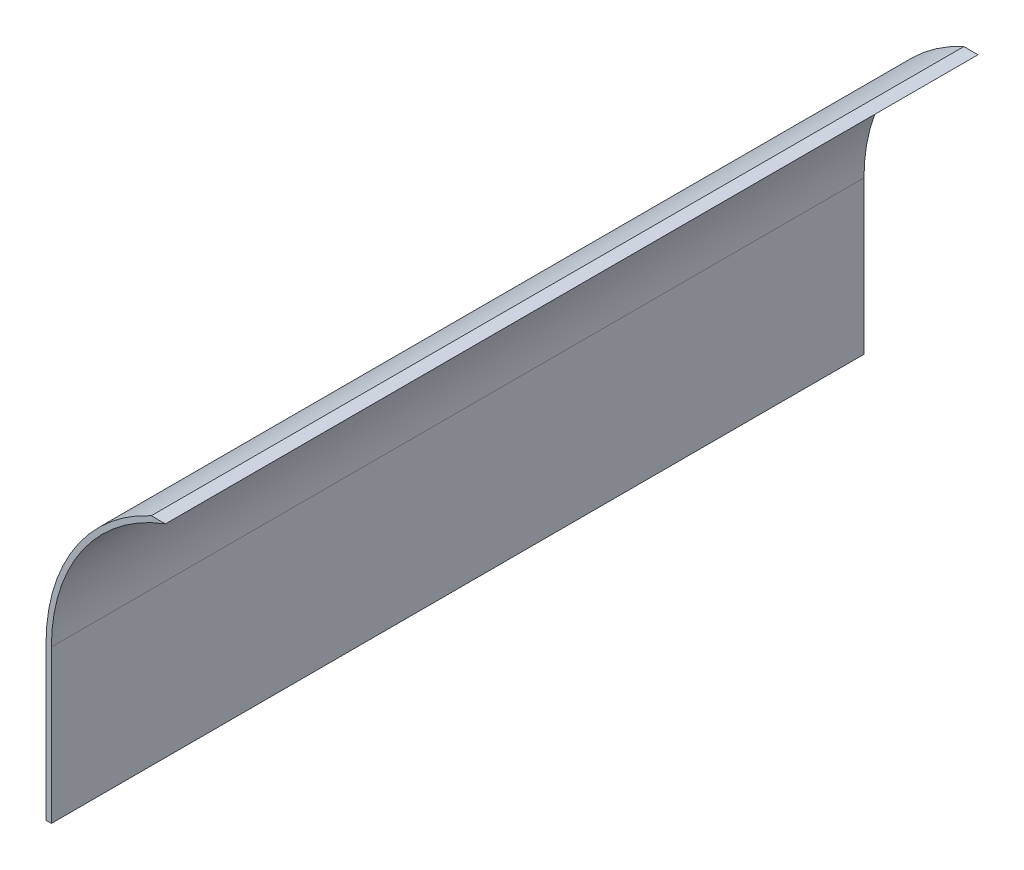
ISO-10303-21;
HEADER;
FILE_DESCRIPTION(('STEP AP214'),'2;1');
FILE_NAME('part.step','',(''),(''),'','','');
FILE_SCHEMA(('AUTOMOTIVE_DESIGN { 1 0 10303 214 1 1 1 1 }'));
ENDSEC;
DATA;
#1=APPLICATION_CONTEXT('core data for automotive mechanical design processes');
#2=APPLICATION_PROTOCOL_DEFINITION('international standard','automotive_design',2000,#1);
#3=PRODUCT_CONTEXT('',#1,'mechanical');
#4=PRODUCT('Part','Part','',(#3));
#5=PRODUCT_RELATED_PRODUCT_CATEGORY('part','',(#4));
#6=PRODUCT_DEFINITION_FORMATION('','',#4);
#7=PRODUCT_DEFINITION_CONTEXT('part definition',#1,'design');
#8=PRODUCT_DEFINITION('design','',#6,#7);
#9=PRODUCT_DEFINITION_SHAPE('','',#8);
#10=(LENGTH_UNIT() NAMED_UNIT(*) SI_UNIT(.MILLI.,.METRE.));
#11=(NAMED_UNIT(*) PLANE_ANGLE_UNIT() SI_UNIT($,.RADIAN.));
#12=(NAMED_UNIT(*) SI_UNIT($,.STERADIAN.) SOLID_ANGLE_UNIT());
#13=UNCERTAINTY_MEASURE_WITH_UNIT(LENGTH_MEASURE(1.E-05),#10,'distance_accuracy_value','');
#14=(GEOMETRIC_REPRESENTATION_CONTEXT(3) GLOBAL_UNCERTAINTY_ASSIGNED_CONTEXT((#13)) GLOBAL_UNIT_ASSIGNED_CONTEXT((#10,
#11,#12)) REPRESENTATION_CONTEXT('',''));
#15=CARTESIAN_POINT('',(0.,0.,0.));
#16=DIRECTION('',(0.,0.,1.));
#17=DIRECTION('',(1.,0.,0.));
#18=AXIS2_PLACEMENT_3D('',#15,#16,#17);
#19=CARTESIAN_POINT('',(-185.,-185.,1000.));
#20=DIRECTION('',(1.,0.,0.));
#21=DIRECTION('',(0.,0.,-1.));
#22=AXIS2_PLACEMENT_3D('',#19,#20,#21);
#23=PLANE('',#22);
#24=DIRECTION('',(0.,-1.,0.));
#25=VECTOR('',#24,1.);
#26=CARTESIAN_POINT('',(-185.,-185.,-1000.));
#27=LINE('',#26,#25);
#28=CARTESIAN_POINT('',(-185.,85.,-1000.));
#29=VERTEX_POINT('',#28);
#30=CARTESIAN_POINT('',(-185.,0.,-1000.));
#31=VERTEX_POINT('',#30);
#32=EDGE_CURVE('E99',#29,#31,#27,.T.);
#33=ORIENTED_EDGE('',*,*,#32,.T.);
#34=DIRECTION('',(0.,0.,-1.));
#35=VECTOR('',#34,1.);
#36=CARTESIAN_POINT('',(-185.,0.,-1000.));
#37=LINE('',#36,#35);
#38=CARTESIAN_POINT('',(-185.,0.,-548.));
#39=VERTEX_POINT('',#38);
#40=EDGE_CURVE('E86',#39,#31,#37,.T.);
#41=ORIENTED_EDGE('',*,*,#40,.F.);
#42=DIRECTION('',(0.,1.,0.));
#43=VECTOR('',#42,1.);
#44=CARTESIAN_POINT('',(-185.,581.96585350996,-548.));
#45=LINE('',#44,#43);
#46=CARTESIAN_POINT('',(-185.,85.,-548.));
#47=VERTEX_POINT('',#46);
#48=EDGE_CURVE('E131',#39,#47,#45,.T.);
#49=ORIENTED_EDGE('',*,*,#48,.T.);
#50=DIRECTION('',(0.,0.,-1.));
#51=VECTOR('',#50,1.);
#52=CARTESIAN_POINT('',(-185.,85.,1000.));
#53=LINE('',#52,#51);
#54=EDGE_CURVE('E105',#47,#29,#53,.T.);
#55=ORIENTED_EDGE('',*,*,#54,.T.);
#56=EDGE_LOOP('',(#33,#41,#49,#55));
#57=FACE_BOUND('',#56,.T.);
#58=ADVANCED_FACE('F36',(#57),#23,.F.);
#59=CARTESIAN_POINT('',(0.,0.,-1000.));
#60=DIRECTION('',(0.,0.,1.));
#61=DIRECTION('',(1.,0.,0.));
#62=AXIS2_PLACEMENT_3D('',#59,#60,#61);
#63=PLANE('',#62);
#64=DIRECTION('',(0.,-1.,0.));
#65=VECTOR('',#64,1.);
#66=CARTESIAN_POINT('',(-182.,-185.,-1000.));
#67=LINE('',#66,#65);
#68=CARTESIAN_POINT('',(-182.,85.,-1000.));
#69=VERTEX_POINT('',#68);
#70=CARTESIAN_POINT('',(-182.,0.,-1000.));
#71=VERTEX_POINT('',#70);
#72=EDGE_CURVE('E102',#69,#71,#67,.T.);
#73=ORIENTED_EDGE('',*,*,#72,.T.);
#74=DIRECTION('',(-1.,0.,0.));
#75=VECTOR('',#74,1.);
#76=CARTESIAN_POINT('',(-118.585711247492,0.,-1000.));
#77=LINE('',#76,#75);
#78=EDGE_CURVE('E89',#71,#31,#77,.T.);
#79=ORIENTED_EDGE('',*,*,#78,.T.);
#80=ORIENTED_EDGE('',*,*,#32,.F.);
#81=CARTESIAN_POINT('',(-85.0000000000001,85.,-1000.));
#82=DIRECTION('',(0.,0.,1.));
#83=DIRECTION('',(1.,0.,0.));
#84=AXIS2_PLACEMENT_3D('',#81,#82,#83);
#85=CIRCLE('',#84,100.);
#86=CARTESIAN_POINT('',(-126.460824883255,176.,-1000.));
#87=VERTEX_POINT('',#86);
#88=EDGE_CURVE('E107',#29,#87,#85,.F.);
#89=ORIENTED_EDGE('',*,*,#88,.T.);
#90=DIRECTION('',(1.,0.,0.));
#91=VECTOR('',#90,1.);
#92=CARTESIAN_POINT('',(0.,176.,-1000.));
#93=LINE('',#92,#91);
#94=CARTESIAN_POINT('',(-118.585711247492,176.,-1000.));
#95=VERTEX_POINT('',#94);
#96=EDGE_CURVE('E133',#87,#95,#93,.T.);
#97=ORIENTED_EDGE('',*,*,#96,.T.);
#98=CARTESIAN_POINT('',(-85.0000000000001,85.,-1000.));
#99=DIRECTION('',(0.,0.,1.));
#100=DIRECTION('',(1.,0.,0.));
#101=AXIS2_PLACEMENT_3D('',#98,#99,#100);
#102=CIRCLE('',#101,97.);
#103=EDGE_CURVE('E111',#69,#95,#102,.F.);
#104=ORIENTED_EDGE('',*,*,#103,.F.);
#105=EDGE_LOOP('',(#73,#79,#80,#89,#97,#104));
#106=FACE_BOUND('',#105,.T.);
#107=ADVANCED_FACE('F97',(#106),#63,.F.);
#108=CARTESIAN_POINT('',(-85.0000000000001,85.,1000.));
#109=DIRECTION('',(0.,0.,-1.));
#110=DIRECTION('',(-1.,0.,0.));
#111=AXIS2_PLACEMENT_3D('',#108,#109,#110);
#112=CYLINDRICAL_SURFACE('',#111,100.);
#113=DIRECTION('',(0.,0.,-1.));
#114=VECTOR('',#113,1.);
#115=CARTESIAN_POINT('',(-126.460824883255,176.,1000.));
#116=LINE('',#115,#114);
#117=CARTESIAN_POINT('',(-126.460824883256,176.,-548.));
#118=VERTEX_POINT('',#117);
#119=EDGE_CURVE('E58',#87,#118,#116,.F.);
#120=ORIENTED_EDGE('',*,*,#119,.F.);
#121=ORIENTED_EDGE('',*,*,#88,.F.);
#122=ORIENTED_EDGE('',*,*,#54,.F.);
#123=CARTESIAN_POINT('',(-85.0000000000001,85.,-548.));
#124=DIRECTION('',(0.,0.,-1.));
#125=DIRECTION('',(0.,1.,0.));
#126=AXIS2_PLACEMENT_3D('',#123,#124,#125);
#127=CIRCLE('',#126,100.);
#128=EDGE_CURVE('E121',#118,#47,#127,.F.);
#129=ORIENTED_EDGE('',*,*,#128,.F.);
#130=EDGE_LOOP('',(#120,#121,#122,#129));
#131=FACE_BOUND('',#130,.T.);
#132=ADVANCED_FACE('F38',(#131),#112,.T.);
#133=CARTESIAN_POINT('',(-182.,-185.,1000.));
#134=DIRECTION('',(1.,0.,0.));
#135=DIRECTION('',(0.,0.,-1.));
#136=AXIS2_PLACEMENT_3D('',#133,#134,#135);
#137=PLANE('',#136);
#138=DIRECTION('',(0.,0.,1.));
#139=VECTOR('',#138,1.);
#140=CARTESIAN_POINT('',(-182.,0.,1000.));
#141=LINE('',#140,#139);
#142=CARTESIAN_POINT('',(-182.,1.11022302462516E-13,-548.));
#143=VERTEX_POINT('',#142);
#144=EDGE_CURVE('E51',#71,#143,#141,.T.);
#145=ORIENTED_EDGE('',*,*,#144,.F.);
#146=ORIENTED_EDGE('',*,*,#72,.F.);
#147=DIRECTION('',(0.,0.,-1.));
#148=VECTOR('',#147,1.);
#149=CARTESIAN_POINT('',(-182.,85.,1000.));
#150=LINE('',#149,#148);
#151=CARTESIAN_POINT('',(-182.,85.,-548.));
#152=VERTEX_POINT('',#151);
#153=EDGE_CURVE('E108',#152,#69,#150,.T.);
#154=ORIENTED_EDGE('',*,*,#153,.F.);
#155=DIRECTION('',(0.,1.,0.));
#156=VECTOR('',#155,1.);
#157=CARTESIAN_POINT('',(-182.,-185.,-548.));
#158=LINE('',#157,#156);
#159=EDGE_CURVE('E126',#143,#152,#158,.T.);
#160=ORIENTED_EDGE('',*,*,#159,.F.);
#161=EDGE_LOOP('',(#145,#146,#154,#160));
#162=FACE_BOUND('',#161,.T.);
#163=ADVANCED_FACE('F160',(#162),#137,.T.);
#164=CARTESIAN_POINT('',(-85.0000000000001,85.,1000.));
#165=DIRECTION('',(0.,0.,-1.));
#166=DIRECTION('',(-1.,0.,0.));
#167=AXIS2_PLACEMENT_3D('',#164,#165,#166);
#168=CYLINDRICAL_SURFACE('',#167,97.);
#169=ORIENTED_EDGE('',*,*,#103,.T.);
#170=DIRECTION('',(0.,0.,-1.));
#171=VECTOR('',#170,1.);
#172=CARTESIAN_POINT('',(-118.585711247492,176.,1000.));
#173=LINE('',#172,#171);
#174=CARTESIAN_POINT('',(-118.585711247494,176.,-548.));
#175=VERTEX_POINT('',#174);
#176=EDGE_CURVE('E137',#95,#175,#173,.F.);
#177=ORIENTED_EDGE('',*,*,#176,.T.);
#178=CARTESIAN_POINT('',(-85.0000000000001,85.,-548.));
#179=DIRECTION('',(0.,0.,-1.));
#180=DIRECTION('',(0.,1.,0.));
#181=AXIS2_PLACEMENT_3D('',#178,#179,#180);
#182=CIRCLE('',#181,97.);
#183=EDGE_CURVE('E123',#175,#152,#182,.F.);
#184=ORIENTED_EDGE('',*,*,#183,.T.);
#185=ORIENTED_EDGE('',*,*,#153,.T.);
#186=EDGE_LOOP('',(#169,#177,#184,#185));
#187=FACE_BOUND('',#186,.T.);
#188=ADVANCED_FACE('F141',(#187),#168,.F.);
#189=CARTESIAN_POINT('',(-185.,581.96585350996,-548.));
#190=DIRECTION('',(0.,0.,-1.));
#191=DIRECTION('',(0.,1.,0.));
#192=AXIS2_PLACEMENT_3D('',#189,#190,#191);
#193=PLANE('',#192);
#194=ORIENTED_EDGE('',*,*,#48,.F.);
#195=DIRECTION('',(1.,0.,0.));
#196=VECTOR('',#195,1.);
#197=CARTESIAN_POINT('',(-185.,1.11022302462516E-13,-548.));
#198=LINE('',#197,#196);
#199=EDGE_CURVE('E11',#39,#143,#198,.T.);
#200=ORIENTED_EDGE('',*,*,#199,.T.);
#201=ORIENTED_EDGE('',*,*,#159,.T.);
#202=ORIENTED_EDGE('',*,*,#183,.F.);
#203=DIRECTION('',(-1.,0.,0.));
#204=VECTOR('',#203,1.);
#205=CARTESIAN_POINT('',(-185.,176.,-548.));
#206=LINE('',#205,#204);
#207=EDGE_CURVE('E44',#175,#118,#206,.T.);
#208=ORIENTED_EDGE('',*,*,#207,.T.);
#209=ORIENTED_EDGE('',*,*,#128,.T.);
#210=EDGE_LOOP('',(#194,#200,#201,#202,#208,#209));
#211=FACE_BOUND('',#210,.T.);
#212=ADVANCED_FACE('F120',(#211),#193,.F.);
#213=CARTESIAN_POINT('',(-1.11022302462516E-13,176.,-1097.10470329676));
#214=DIRECTION('',(0.,-1.,0.));
#215=DIRECTION('',(0.,0.,-1.));
#216=AXIS2_PLACEMENT_3D('',#213,#214,#215);
#217=PLANE('',#216);
#218=ORIENTED_EDGE('',*,*,#119,.T.);
#219=ORIENTED_EDGE('',*,*,#207,.F.);
#220=ORIENTED_EDGE('',*,*,#176,.F.);
#221=ORIENTED_EDGE('',*,*,#96,.F.);
#222=EDGE_LOOP('',(#218,#219,#220,#221));
#223=FACE_BOUND('',#222,.T.);
#224=ADVANCED_FACE('F143',(#223),#217,.F.);
#225=CARTESIAN_POINT('',(-118.585711247492,0.,-1000.));
#226=DIRECTION('',(0.,1.,0.));
#227=DIRECTION('',(0.,0.,1.));
#228=AXIS2_PLACEMENT_3D('',#225,#226,#227);
#229=PLANE('',#228);
#230=ORIENTED_EDGE('',*,*,#144,.T.);
#231=ORIENTED_EDGE('',*,*,#199,.F.);
#232=ORIENTED_EDGE('',*,*,#40,.T.);
#233=ORIENTED_EDGE('',*,*,#78,.F.);
#234=EDGE_LOOP('',(#230,#231,#232,#233));
#235=FACE_BOUND('',#234,.T.);
#236=ADVANCED_FACE('F88',(#235),#229,.F.);
#237=CLOSED_SHELL('',(#58,#107,#132,#163,#188,#212,#224,#236));
#238=MANIFOLD_SOLID_BREP('B2',#237);
#239=ADVANCED_BREP_SHAPE_REPRESENTATION('',(#18,#238),#14);
#240=SHAPE_DEFINITION_REPRESENTATION(#9,#239);
ENDSEC;
END-ISO-10303-21;
